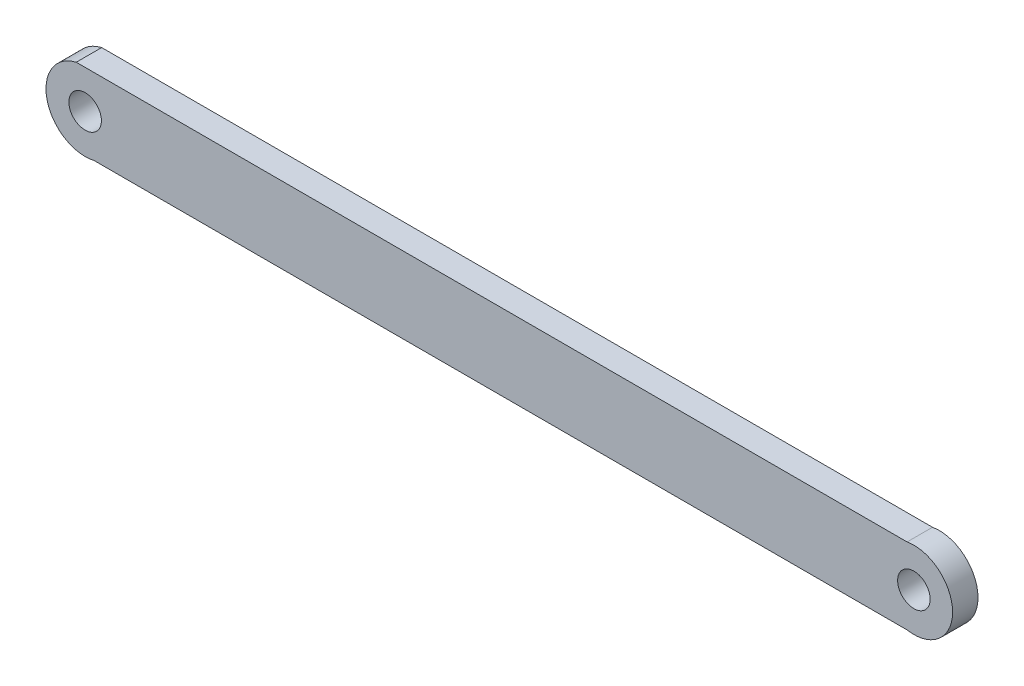
ISO-10303-21;
HEADER;
FILE_DESCRIPTION(('STEP AP214'),'2;1');
FILE_NAME('part.step','',(''),(''),'','','');
FILE_SCHEMA(('AUTOMOTIVE_DESIGN { 1 0 10303 214 1 1 1 1 }'));
ENDSEC;
DATA;
#1=APPLICATION_CONTEXT('core data for automotive mechanical design processes');
#2=APPLICATION_PROTOCOL_DEFINITION('international standard','automotive_design',2000,#1);
#3=PRODUCT_CONTEXT('',#1,'mechanical');
#4=PRODUCT('Part','Part','',(#3));
#5=PRODUCT_RELATED_PRODUCT_CATEGORY('part','',(#4));
#6=PRODUCT_DEFINITION_FORMATION('','',#4);
#7=PRODUCT_DEFINITION_CONTEXT('part definition',#1,'design');
#8=PRODUCT_DEFINITION('design','',#6,#7);
#9=PRODUCT_DEFINITION_SHAPE('','',#8);
#10=(LENGTH_UNIT() NAMED_UNIT(*) SI_UNIT(.MILLI.,.METRE.));
#11=(NAMED_UNIT(*) PLANE_ANGLE_UNIT() SI_UNIT($,.RADIAN.));
#12=(NAMED_UNIT(*) SI_UNIT($,.STERADIAN.) SOLID_ANGLE_UNIT());
#13=UNCERTAINTY_MEASURE_WITH_UNIT(LENGTH_MEASURE(1.E-05),#10,'distance_accuracy_value','');
#14=(GEOMETRIC_REPRESENTATION_CONTEXT(3) GLOBAL_UNCERTAINTY_ASSIGNED_CONTEXT((#13)) GLOBAL_UNIT_ASSIGNED_CONTEXT((#10,
#11,#12)) REPRESENTATION_CONTEXT('',''));
#15=CARTESIAN_POINT('',(0.,0.,0.));
#16=DIRECTION('',(0.,0.,1.));
#17=DIRECTION('',(1.,0.,0.));
#18=AXIS2_PLACEMENT_3D('',#15,#16,#17);
#19=CARTESIAN_POINT('',(52.7577425635884,-0.0748820754716854,3.175));
#20=DIRECTION('',(0.,0.,1.));
#21=DIRECTION('',(1.,0.,0.));
#22=AXIS2_PLACEMENT_3D('',#19,#20,#21);
#23=PLANE('',#22);
#24=CARTESIAN_POINT('',(-50.8,-0.0748820754716854,3.175));
#25=DIRECTION('',(0.,0.,1.));
#26=DIRECTION('',(1.,0.,0.));
#27=AXIS2_PLACEMENT_3D('',#24,#25,#26);
#28=CIRCLE('',#27,2.032);
#29=CARTESIAN_POINT('',(-48.768,-0.0748820754716854,3.175));
#30=VERTEX_POINT('',#29);
#31=EDGE_CURVE('E100',#30,#30,#28,.T.);
#32=ORIENTED_EDGE('',*,*,#31,.F.);
#33=EDGE_LOOP('',(#32));
#34=FACE_BOUND('',#33,.T.);
#35=CARTESIAN_POINT('',(52.7577425635884,-0.0748820754716854,3.175));
#36=DIRECTION('',(0.,0.,1.));
#37=DIRECTION('',(1.,0.,0.));
#38=AXIS2_PLACEMENT_3D('',#35,#36,#37);
#39=CIRCLE('',#38,4.83738207547169);
#40=CARTESIAN_POINT('',(51.9098869779521,-4.83738207547169,3.175));
#41=VERTEX_POINT('',#40);
#42=CARTESIAN_POINT('',(51.9098869779521,4.68761792452831,3.175));
#43=VERTEX_POINT('',#42);
#44=EDGE_CURVE('E85',#41,#43,#39,.T.);
#45=ORIENTED_EDGE('',*,*,#44,.T.);
#46=DIRECTION('',(-1.,0.,0.));
#47=VECTOR('',#46,1.);
#48=CARTESIAN_POINT('',(-51.9098869779521,4.68761792452831,3.175));
#49=LINE('',#48,#47);
#50=CARTESIAN_POINT('',(-51.9098869779521,4.68761792452831,3.175));
#51=VERTEX_POINT('',#50);
#52=EDGE_CURVE('E80',#43,#51,#49,.T.);
#53=ORIENTED_EDGE('',*,*,#52,.T.);
#54=CARTESIAN_POINT('',(-50.8,-0.0748820754716854,3.175));
#55=DIRECTION('',(0.,0.,1.));
#56=DIRECTION('',(1.,0.,0.));
#57=AXIS2_PLACEMENT_3D('',#54,#55,#56);
#58=CIRCLE('',#57,4.89011813291127);
#59=CARTESIAN_POINT('',(-49.6901130220479,-4.83738207547169,3.175));
#60=VERTEX_POINT('',#59);
#61=EDGE_CURVE('E83',#51,#60,#58,.T.);
#62=ORIENTED_EDGE('',*,*,#61,.T.);
#63=DIRECTION('',(1.,0.,0.));
#64=VECTOR('',#63,1.);
#65=CARTESIAN_POINT('',(-49.6901130220479,-4.83738207547169,3.175));
#66=LINE('',#65,#64);
#67=EDGE_CURVE('E50',#60,#41,#66,.T.);
#68=ORIENTED_EDGE('',*,*,#67,.T.);
#69=EDGE_LOOP('',(#45,#53,#62,#68));
#70=FACE_BOUND('',#69,.T.);
#71=CARTESIAN_POINT('',(52.7577425635884,-0.0748820754716854,3.175));
#72=DIRECTION('',(0.,0.,1.));
#73=DIRECTION('',(1.,0.,0.));
#74=AXIS2_PLACEMENT_3D('',#71,#72,#73);
#75=CIRCLE('',#74,2.032);
#76=CARTESIAN_POINT('',(54.7897425635884,-0.0748820754716854,3.175));
#77=VERTEX_POINT('',#76);
#78=EDGE_CURVE('E115',#77,#77,#75,.T.);
#79=ORIENTED_EDGE('',*,*,#78,.F.);
#80=EDGE_LOOP('',(#79));
#81=FACE_BOUND('',#80,.T.);
#82=ADVANCED_FACE('F33',(#34,#70,#81),#23,.T.);
#83=CARTESIAN_POINT('',(52.7577425635884,-0.0748820754716854,0.));
#84=DIRECTION('',(0.,0.,1.));
#85=DIRECTION('',(1.,0.,0.));
#86=AXIS2_PLACEMENT_3D('',#83,#84,#85);
#87=PLANE('',#86);
#88=CARTESIAN_POINT('',(-50.8,-0.0748820754716854,0.));
#89=DIRECTION('',(0.,0.,1.));
#90=DIRECTION('',(1.,0.,0.));
#91=AXIS2_PLACEMENT_3D('',#88,#89,#90);
#92=CIRCLE('',#91,2.032);
#93=CARTESIAN_POINT('',(-48.768,-0.0748820754716854,0.));
#94=VERTEX_POINT('',#93);
#95=EDGE_CURVE('E112',#94,#94,#92,.T.);
#96=ORIENTED_EDGE('',*,*,#95,.T.);
#97=EDGE_LOOP('',(#96));
#98=FACE_BOUND('',#97,.T.);
#99=CARTESIAN_POINT('',(52.7577425635884,-0.0748820754716854,0.));
#100=DIRECTION('',(0.,0.,1.));
#101=DIRECTION('',(1.,0.,0.));
#102=AXIS2_PLACEMENT_3D('',#99,#100,#101);
#103=CIRCLE('',#102,4.83738207547169);
#104=CARTESIAN_POINT('',(51.9098869779521,-4.83738207547169,0.));
#105=VERTEX_POINT('',#104);
#106=CARTESIAN_POINT('',(51.9098869779521,4.68761792452831,0.));
#107=VERTEX_POINT('',#106);
#108=EDGE_CURVE('E97',#105,#107,#103,.T.);
#109=ORIENTED_EDGE('',*,*,#108,.F.);
#110=DIRECTION('',(1.,0.,0.));
#111=VECTOR('',#110,1.);
#112=CARTESIAN_POINT('',(-49.6901130220479,-4.83738207547169,0.));
#113=LINE('',#112,#111);
#114=CARTESIAN_POINT('',(-49.6901130220479,-4.83738207547169,0.));
#115=VERTEX_POINT('',#114);
#116=EDGE_CURVE('E73',#115,#105,#113,.T.);
#117=ORIENTED_EDGE('',*,*,#116,.F.);
#118=CARTESIAN_POINT('',(-50.8,-0.0748820754716854,0.));
#119=DIRECTION('',(0.,0.,1.));
#120=DIRECTION('',(1.,0.,0.));
#121=AXIS2_PLACEMENT_3D('',#118,#119,#120);
#122=CIRCLE('',#121,4.89011813291127);
#123=CARTESIAN_POINT('',(-51.9098869779521,4.68761792452831,0.));
#124=VERTEX_POINT('',#123);
#125=EDGE_CURVE('E67',#124,#115,#122,.T.);
#126=ORIENTED_EDGE('',*,*,#125,.F.);
#127=DIRECTION('',(-1.,0.,0.));
#128=VECTOR('',#127,1.);
#129=CARTESIAN_POINT('',(-51.9098869779521,4.68761792452831,0.));
#130=LINE('',#129,#128);
#131=EDGE_CURVE('E89',#107,#124,#130,.T.);
#132=ORIENTED_EDGE('',*,*,#131,.F.);
#133=EDGE_LOOP('',(#109,#117,#126,#132));
#134=FACE_BOUND('',#133,.T.);
#135=CARTESIAN_POINT('',(52.7577425635884,-0.0748820754716854,0.));
#136=DIRECTION('',(0.,0.,1.));
#137=DIRECTION('',(1.,0.,0.));
#138=AXIS2_PLACEMENT_3D('',#135,#136,#137);
#139=CIRCLE('',#138,2.032);
#140=CARTESIAN_POINT('',(54.7897425635884,-0.0748820754716854,0.));
#141=VERTEX_POINT('',#140);
#142=EDGE_CURVE('E118',#141,#141,#139,.T.);
#143=ORIENTED_EDGE('',*,*,#142,.T.);
#144=EDGE_LOOP('',(#143));
#145=FACE_BOUND('',#144,.T.);
#146=ADVANCED_FACE('F108',(#98,#134,#145),#87,.F.);
#147=CARTESIAN_POINT('',(52.7577425635884,-0.0748820754716854,3.175));
#148=DIRECTION('',(0.,0.,-1.));
#149=DIRECTION('',(-1.,0.,0.));
#150=AXIS2_PLACEMENT_3D('',#147,#148,#149);
#151=CYLINDRICAL_SURFACE('',#150,4.83738207547169);
#152=ORIENTED_EDGE('',*,*,#108,.T.);
#153=DIRECTION('',(0.,0.,-1.));
#154=VECTOR('',#153,1.);
#155=CARTESIAN_POINT('',(51.9098869779521,4.68761792452831,3.175));
#156=LINE('',#155,#154);
#157=EDGE_CURVE('E11',#43,#107,#156,.T.);
#158=ORIENTED_EDGE('',*,*,#157,.F.);
#159=ORIENTED_EDGE('',*,*,#44,.F.);
#160=DIRECTION('',(0.,0.,-1.));
#161=VECTOR('',#160,1.);
#162=CARTESIAN_POINT('',(51.9098869779521,-4.83738207547169,3.175));
#163=LINE('',#162,#161);
#164=EDGE_CURVE('E93',#41,#105,#163,.T.);
#165=ORIENTED_EDGE('',*,*,#164,.T.);
#166=EDGE_LOOP('',(#152,#158,#159,#165));
#167=FACE_BOUND('',#166,.T.);
#168=ADVANCED_FACE('F35',(#167),#151,.T.);
#169=CARTESIAN_POINT('',(-51.9098869779521,4.68761792452831,3.175));
#170=DIRECTION('',(0.,-1.,0.));
#171=DIRECTION('',(0.,0.,-1.));
#172=AXIS2_PLACEMENT_3D('',#169,#170,#171);
#173=PLANE('',#172);
#174=ORIENTED_EDGE('',*,*,#131,.T.);
#175=DIRECTION('',(0.,0.,-1.));
#176=VECTOR('',#175,1.);
#177=CARTESIAN_POINT('',(-51.9098869779521,4.68761792452831,3.175));
#178=LINE('',#177,#176);
#179=EDGE_CURVE('E42',#51,#124,#178,.T.);
#180=ORIENTED_EDGE('',*,*,#179,.F.);
#181=ORIENTED_EDGE('',*,*,#52,.F.);
#182=ORIENTED_EDGE('',*,*,#157,.T.);
#183=EDGE_LOOP('',(#174,#180,#181,#182));
#184=FACE_BOUND('',#183,.T.);
#185=ADVANCED_FACE('F88',(#184),#173,.F.);
#186=CARTESIAN_POINT('',(-50.8,-0.0748820754716854,3.175));
#187=DIRECTION('',(0.,0.,-1.));
#188=DIRECTION('',(-1.,0.,0.));
#189=AXIS2_PLACEMENT_3D('',#186,#187,#188);
#190=CYLINDRICAL_SURFACE('',#189,4.89011813291127);
#191=ORIENTED_EDGE('',*,*,#125,.T.);
#192=DIRECTION('',(0.,0.,-1.));
#193=VECTOR('',#192,1.);
#194=CARTESIAN_POINT('',(-49.6901130220479,-4.83738207547169,3.175));
#195=LINE('',#194,#193);
#196=EDGE_CURVE('E90',#60,#115,#195,.T.);
#197=ORIENTED_EDGE('',*,*,#196,.F.);
#198=ORIENTED_EDGE('',*,*,#61,.F.);
#199=ORIENTED_EDGE('',*,*,#179,.T.);
#200=EDGE_LOOP('',(#191,#197,#198,#199));
#201=FACE_BOUND('',#200,.T.);
#202=ADVANCED_FACE('F91',(#201),#190,.T.);
#203=CARTESIAN_POINT('',(-49.6901130220479,-4.83738207547169,3.175));
#204=DIRECTION('',(0.,1.,0.));
#205=DIRECTION('',(0.,0.,1.));
#206=AXIS2_PLACEMENT_3D('',#203,#204,#205);
#207=PLANE('',#206);
#208=ORIENTED_EDGE('',*,*,#116,.T.);
#209=ORIENTED_EDGE('',*,*,#164,.F.);
#210=ORIENTED_EDGE('',*,*,#67,.F.);
#211=ORIENTED_EDGE('',*,*,#196,.T.);
#212=EDGE_LOOP('',(#208,#209,#210,#211));
#213=FACE_BOUND('',#212,.T.);
#214=ADVANCED_FACE('F105',(#213),#207,.F.);
#215=CARTESIAN_POINT('',(-50.8,-0.0748820754716854,3.175));
#216=DIRECTION('',(0.,0.,-1.));
#217=DIRECTION('',(-1.,0.,0.));
#218=AXIS2_PLACEMENT_3D('',#215,#216,#217);
#219=CYLINDRICAL_SURFACE('',#218,2.032);
#220=ORIENTED_EDGE('',*,*,#31,.T.);
#221=EDGE_LOOP('',(#220));
#222=FACE_BOUND('',#221,.T.);
#223=ORIENTED_EDGE('',*,*,#95,.F.);
#224=EDGE_LOOP('',(#223));
#225=FACE_BOUND('',#224,.T.);
#226=ADVANCED_FACE('F136',(#222,#225),#219,.F.);
#227=CARTESIAN_POINT('',(52.7577425635884,-0.0748820754716854,3.175));
#228=DIRECTION('',(0.,0.,-1.));
#229=DIRECTION('',(-1.,0.,0.));
#230=AXIS2_PLACEMENT_3D('',#227,#228,#229);
#231=CYLINDRICAL_SURFACE('',#230,2.032);
#232=ORIENTED_EDGE('',*,*,#78,.T.);
#233=EDGE_LOOP('',(#232));
#234=FACE_BOUND('',#233,.T.);
#235=ORIENTED_EDGE('',*,*,#142,.F.);
#236=EDGE_LOOP('',(#235));
#237=FACE_BOUND('',#236,.T.);
#238=ADVANCED_FACE('F124',(#234,#237),#231,.F.);
#239=CLOSED_SHELL('',(#82,#146,#168,#185,#202,#214,#226,#238));
#240=MANIFOLD_SOLID_BREP('B2',#239);
#241=ADVANCED_BREP_SHAPE_REPRESENTATION('',(#18,#240),#14);
#242=SHAPE_DEFINITION_REPRESENTATION(#9,#241);
ENDSEC;
END-ISO-10303-21;
